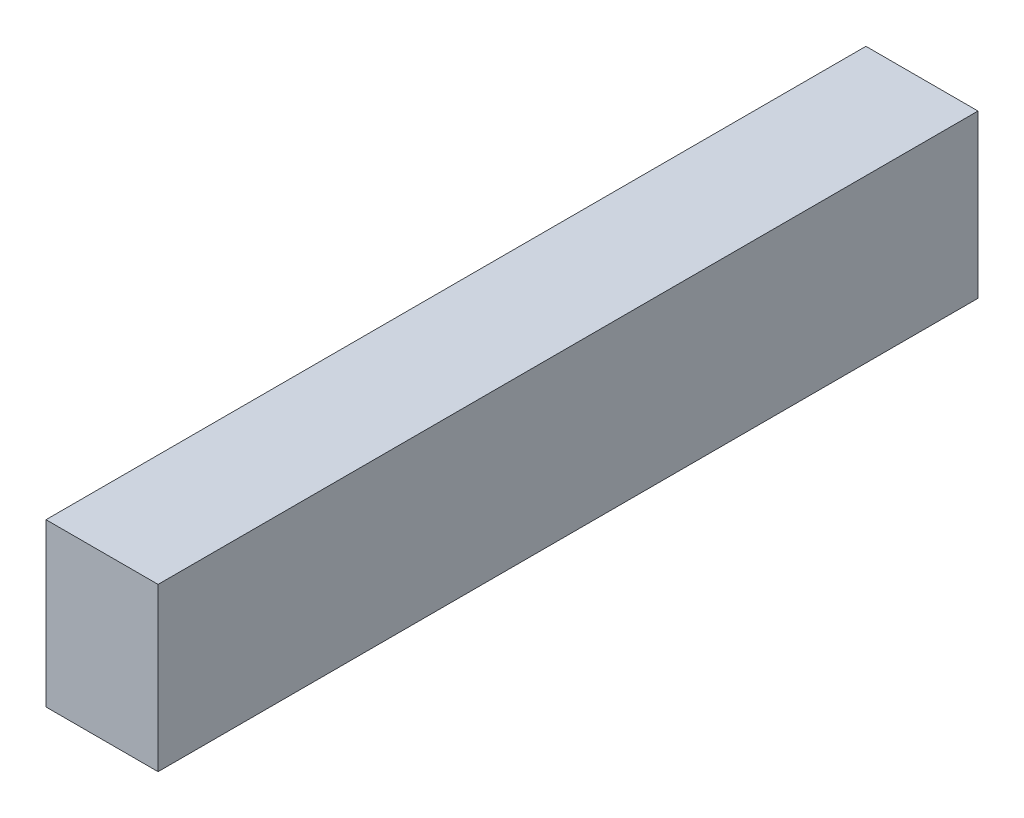
ISO-10303-21;
HEADER;
FILE_DESCRIPTION(('STEP AP214'),'2;1');
FILE_NAME('part.step','',(''),(''),'','','');
FILE_SCHEMA(('AUTOMOTIVE_DESIGN { 1 0 10303 214 1 1 1 1 }'));
ENDSEC;
DATA;
#1=APPLICATION_CONTEXT('core data for automotive mechanical design processes');
#2=APPLICATION_PROTOCOL_DEFINITION('international standard','automotive_design',2000,#1);
#3=PRODUCT_CONTEXT('',#1,'mechanical');
#4=PRODUCT('Part','Part','',(#3));
#5=PRODUCT_RELATED_PRODUCT_CATEGORY('part','',(#4));
#6=PRODUCT_DEFINITION_FORMATION('','',#4);
#7=PRODUCT_DEFINITION_CONTEXT('part definition',#1,'design');
#8=PRODUCT_DEFINITION('design','',#6,#7);
#9=PRODUCT_DEFINITION_SHAPE('','',#8);
#10=(LENGTH_UNIT() NAMED_UNIT(*) SI_UNIT(.MILLI.,.METRE.));
#11=(NAMED_UNIT(*) PLANE_ANGLE_UNIT() SI_UNIT($,.RADIAN.));
#12=(NAMED_UNIT(*) SI_UNIT($,.STERADIAN.) SOLID_ANGLE_UNIT());
#13=UNCERTAINTY_MEASURE_WITH_UNIT(LENGTH_MEASURE(1.E-05),#10,'distance_accuracy_value','');
#14=(GEOMETRIC_REPRESENTATION_CONTEXT(3) GLOBAL_UNCERTAINTY_ASSIGNED_CONTEXT((#13)) GLOBAL_UNIT_ASSIGNED_CONTEXT((#10,
#11,#12)) REPRESENTATION_CONTEXT('',''));
#15=CARTESIAN_POINT('',(0.,0.,0.));
#16=DIRECTION('',(0.,0.,1.));
#17=DIRECTION('',(1.,0.,0.));
#18=AXIS2_PLACEMENT_3D('',#15,#16,#17);
#19=CARTESIAN_POINT('',(0.,5.5,0.));
#20=DIRECTION('',(1.,0.,0.));
#21=DIRECTION('',(0.,0.,-1.));
#22=AXIS2_PLACEMENT_3D('',#19,#20,#21);
#23=PLANE('',#22);
#24=DIRECTION('',(0.,0.,1.));
#25=VECTOR('',#24,1.);
#26=CARTESIAN_POINT('',(0.,0.,0.));
#27=LINE('',#26,#25);
#28=CARTESIAN_POINT('',(0.,0.,-27.8));
#29=VERTEX_POINT('',#28);
#30=CARTESIAN_POINT('',(0.,0.,0.));
#31=VERTEX_POINT('',#30);
#32=EDGE_CURVE('E96',#29,#31,#27,.T.);
#33=ORIENTED_EDGE('',*,*,#32,.T.);
#34=DIRECTION('',(0.,-1.,0.));
#35=VECTOR('',#34,1.);
#36=CARTESIAN_POINT('',(0.,5.5,0.));
#37=LINE('',#36,#35);
#38=CARTESIAN_POINT('',(0.,5.5,0.));
#39=VERTEX_POINT('',#38);
#40=EDGE_CURVE('E11',#39,#31,#37,.T.);
#41=ORIENTED_EDGE('',*,*,#40,.F.);
#42=DIRECTION('',(0.,0.,1.));
#43=VECTOR('',#42,1.);
#44=CARTESIAN_POINT('',(0.,5.5,0.));
#45=LINE('',#44,#43);
#46=CARTESIAN_POINT('',(0.,5.5,-27.8));
#47=VERTEX_POINT('',#46);
#48=EDGE_CURVE('E84',#47,#39,#45,.T.);
#49=ORIENTED_EDGE('',*,*,#48,.F.);
#50=DIRECTION('',(0.,-1.,0.));
#51=VECTOR('',#50,1.);
#52=CARTESIAN_POINT('',(0.,5.5,-27.8));
#53=LINE('',#52,#51);
#54=EDGE_CURVE('E92',#47,#29,#53,.T.);
#55=ORIENTED_EDGE('',*,*,#54,.T.);
#56=EDGE_LOOP('',(#33,#41,#49,#55));
#57=FACE_BOUND('',#56,.T.);
#58=ADVANCED_FACE('F33',(#57),#23,.F.);
#59=CARTESIAN_POINT('',(0.,5.5,0.));
#60=DIRECTION('',(0.,0.,-1.));
#61=DIRECTION('',(-1.,0.,0.));
#62=AXIS2_PLACEMENT_3D('',#59,#60,#61);
#63=PLANE('',#62);
#64=DIRECTION('',(1.,0.,0.));
#65=VECTOR('',#64,1.);
#66=CARTESIAN_POINT('',(0.,0.,0.));
#67=LINE('',#66,#65);
#68=CARTESIAN_POINT('',(3.8,0.,0.));
#69=VERTEX_POINT('',#68);
#70=EDGE_CURVE('E88',#31,#69,#67,.T.);
#71=ORIENTED_EDGE('',*,*,#70,.T.);
#72=DIRECTION('',(0.,-1.,0.));
#73=VECTOR('',#72,1.);
#74=CARTESIAN_POINT('',(3.8,5.5,0.));
#75=LINE('',#74,#73);
#76=CARTESIAN_POINT('',(3.8,5.5,0.));
#77=VERTEX_POINT('',#76);
#78=EDGE_CURVE('E41',#77,#69,#75,.T.);
#79=ORIENTED_EDGE('',*,*,#78,.F.);
#80=DIRECTION('',(1.,0.,0.));
#81=VECTOR('',#80,1.);
#82=CARTESIAN_POINT('',(0.,5.5,0.));
#83=LINE('',#82,#81);
#84=EDGE_CURVE('E79',#39,#77,#83,.T.);
#85=ORIENTED_EDGE('',*,*,#84,.F.);
#86=ORIENTED_EDGE('',*,*,#40,.T.);
#87=EDGE_LOOP('',(#71,#79,#85,#86));
#88=FACE_BOUND('',#87,.T.);
#89=ADVANCED_FACE('F87',(#88),#63,.F.);
#90=CARTESIAN_POINT('',(3.8,5.5,0.));
#91=DIRECTION('',(-1.,0.,0.));
#92=DIRECTION('',(0.,0.,1.));
#93=AXIS2_PLACEMENT_3D('',#90,#91,#92);
#94=PLANE('',#93);
#95=DIRECTION('',(0.,0.,-1.));
#96=VECTOR('',#95,1.);
#97=CARTESIAN_POINT('',(3.8,0.,0.));
#98=LINE('',#97,#96);
#99=CARTESIAN_POINT('',(3.79999999999999,0.,-27.8));
#100=VERTEX_POINT('',#99);
#101=EDGE_CURVE('E66',#69,#100,#98,.T.);
#102=ORIENTED_EDGE('',*,*,#101,.T.);
#103=DIRECTION('',(0.,-1.,0.));
#104=VECTOR('',#103,1.);
#105=CARTESIAN_POINT('',(3.79999999999999,5.5,-27.8));
#106=LINE('',#105,#104);
#107=CARTESIAN_POINT('',(3.79999999999999,5.5,-27.8));
#108=VERTEX_POINT('',#107);
#109=EDGE_CURVE('E89',#108,#100,#106,.T.);
#110=ORIENTED_EDGE('',*,*,#109,.F.);
#111=DIRECTION('',(0.,0.,-1.));
#112=VECTOR('',#111,1.);
#113=CARTESIAN_POINT('',(3.8,5.5,0.));
#114=LINE('',#113,#112);
#115=EDGE_CURVE('E82',#77,#108,#114,.T.);
#116=ORIENTED_EDGE('',*,*,#115,.F.);
#117=ORIENTED_EDGE('',*,*,#78,.T.);
#118=EDGE_LOOP('',(#102,#110,#116,#117));
#119=FACE_BOUND('',#118,.T.);
#120=ADVANCED_FACE('F90',(#119),#94,.F.);
#121=CARTESIAN_POINT('',(0.,5.5,-27.8));
#122=DIRECTION('',(0.,0.,1.));
#123=DIRECTION('',(1.,0.,0.));
#124=AXIS2_PLACEMENT_3D('',#121,#122,#123);
#125=PLANE('',#124);
#126=DIRECTION('',(-1.,0.,0.));
#127=VECTOR('',#126,1.);
#128=CARTESIAN_POINT('',(0.,0.,-27.8));
#129=LINE('',#128,#127);
#130=EDGE_CURVE('E72',#100,#29,#129,.T.);
#131=ORIENTED_EDGE('',*,*,#130,.T.);
#132=ORIENTED_EDGE('',*,*,#54,.F.);
#133=DIRECTION('',(-1.,0.,0.));
#134=VECTOR('',#133,1.);
#135=CARTESIAN_POINT('',(0.,5.5,-27.8));
#136=LINE('',#135,#134);
#137=EDGE_CURVE('E49',#108,#47,#136,.T.);
#138=ORIENTED_EDGE('',*,*,#137,.F.);
#139=ORIENTED_EDGE('',*,*,#109,.T.);
#140=EDGE_LOOP('',(#131,#132,#138,#139));
#141=FACE_BOUND('',#140,.T.);
#142=ADVANCED_FACE('F103',(#141),#125,.F.);
#143=CARTESIAN_POINT('',(0.,5.5,0.));
#144=DIRECTION('',(0.,-1.,0.));
#145=DIRECTION('',(0.,0.,-1.));
#146=AXIS2_PLACEMENT_3D('',#143,#144,#145);
#147=PLANE('',#146);
#148=ORIENTED_EDGE('',*,*,#48,.T.);
#149=ORIENTED_EDGE('',*,*,#84,.T.);
#150=ORIENTED_EDGE('',*,*,#115,.T.);
#151=ORIENTED_EDGE('',*,*,#137,.T.);
#152=EDGE_LOOP('',(#148,#149,#150,#151));
#153=FACE_BOUND('',#152,.T.);
#154=ADVANCED_FACE('F80',(#153),#147,.F.);
#155=CARTESIAN_POINT('',(0.,0.,0.));
#156=DIRECTION('',(0.,-1.,0.));
#157=DIRECTION('',(0.,0.,-1.));
#158=AXIS2_PLACEMENT_3D('',#155,#156,#157);
#159=PLANE('',#158);
#160=ORIENTED_EDGE('',*,*,#32,.F.);
#161=ORIENTED_EDGE('',*,*,#130,.F.);
#162=ORIENTED_EDGE('',*,*,#101,.F.);
#163=ORIENTED_EDGE('',*,*,#70,.F.);
#164=EDGE_LOOP('',(#160,#161,#162,#163));
#165=FACE_BOUND('',#164,.T.);
#166=ADVANCED_FACE('F106',(#165),#159,.T.);
#167=CLOSED_SHELL('',(#58,#89,#120,#142,#154,#166));
#168=MANIFOLD_SOLID_BREP('B2',#167);
#169=ADVANCED_BREP_SHAPE_REPRESENTATION('',(#18,#168),#14);
#170=SHAPE_DEFINITION_REPRESENTATION(#9,#169);
ENDSEC;
END-ISO-10303-21;
